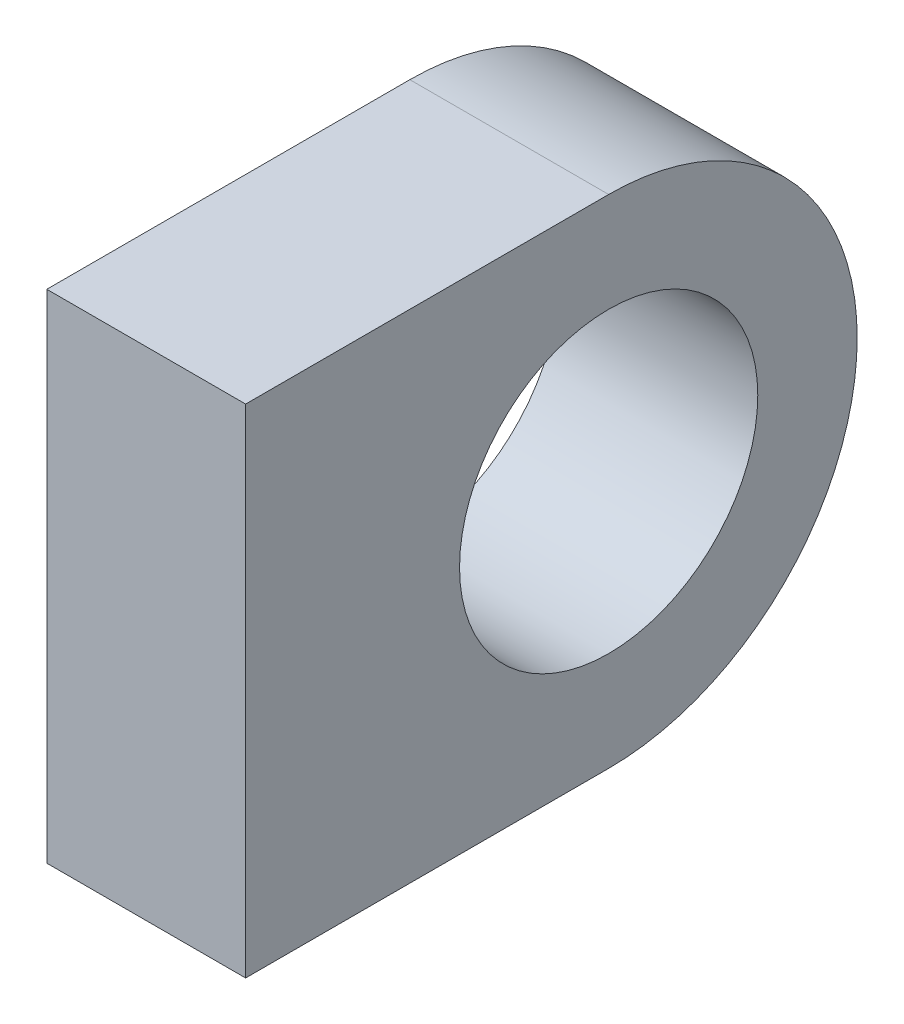
ISO-10303-21;
HEADER;
FILE_DESCRIPTION(('STEP AP214'),'2;1');
FILE_NAME('part.step','',(''),(''),'','','');
FILE_SCHEMA(('AUTOMOTIVE_DESIGN { 1 0 10303 214 1 1 1 1 }'));
ENDSEC;
DATA;
#1=APPLICATION_CONTEXT('core data for automotive mechanical design processes');
#2=APPLICATION_PROTOCOL_DEFINITION('international standard','automotive_design',2000,#1);
#3=PRODUCT_CONTEXT('',#1,'mechanical');
#4=PRODUCT('Part','Part','',(#3));
#5=PRODUCT_RELATED_PRODUCT_CATEGORY('part','',(#4));
#6=PRODUCT_DEFINITION_FORMATION('','',#4);
#7=PRODUCT_DEFINITION_CONTEXT('part definition',#1,'design');
#8=PRODUCT_DEFINITION('design','',#6,#7);
#9=PRODUCT_DEFINITION_SHAPE('','',#8);
#10=(LENGTH_UNIT() NAMED_UNIT(*) SI_UNIT(.MILLI.,.METRE.));
#11=(NAMED_UNIT(*) PLANE_ANGLE_UNIT() SI_UNIT($,.RADIAN.));
#12=(NAMED_UNIT(*) SI_UNIT($,.STERADIAN.) SOLID_ANGLE_UNIT());
#13=UNCERTAINTY_MEASURE_WITH_UNIT(LENGTH_MEASURE(1.E-05),#10,'distance_accuracy_value','');
#14=(GEOMETRIC_REPRESENTATION_CONTEXT(3) GLOBAL_UNCERTAINTY_ASSIGNED_CONTEXT((#13)) GLOBAL_UNIT_ASSIGNED_CONTEXT((#10,
#11,#12)) REPRESENTATION_CONTEXT('',''));
#15=CARTESIAN_POINT('',(0.,0.,0.));
#16=DIRECTION('',(0.,0.,1.));
#17=DIRECTION('',(1.,0.,0.));
#18=AXIS2_PLACEMENT_3D('',#15,#16,#17);
#19=CARTESIAN_POINT('',(10.,0.,0.));
#20=DIRECTION('',(1.,0.,0.));
#21=DIRECTION('',(0.,0.,-1.));
#22=AXIS2_PLACEMENT_3D('',#19,#20,#21);
#23=PLANE('',#22);
#24=CARTESIAN_POINT('',(10.,0.,0.));
#25=DIRECTION('',(1.,0.,0.));
#26=DIRECTION('',(0.,0.,-1.));
#27=AXIS2_PLACEMENT_3D('',#24,#25,#26);
#28=CIRCLE('',#27,12.5);
#29=CARTESIAN_POINT('',(10.,-12.5,0.));
#30=VERTEX_POINT('',#29);
#31=CARTESIAN_POINT('',(10.,12.5,0.));
#32=VERTEX_POINT('',#31);
#33=EDGE_CURVE('E84',#30,#32,#28,.T.);
#34=ORIENTED_EDGE('',*,*,#33,.T.);
#35=DIRECTION('',(0.,0.,1.));
#36=VECTOR('',#35,1.);
#37=CARTESIAN_POINT('',(10.,12.5,0.));
#38=LINE('',#37,#36);
#39=CARTESIAN_POINT('',(10.,12.5,18.2590535));
#40=VERTEX_POINT('',#39);
#41=EDGE_CURVE('E79',#32,#40,#38,.T.);
#42=ORIENTED_EDGE('',*,*,#41,.T.);
#43=DIRECTION('',(0.,-1.,0.));
#44=VECTOR('',#43,1.);
#45=CARTESIAN_POINT('',(10.,-12.5,18.2590535));
#46=LINE('',#45,#44);
#47=CARTESIAN_POINT('',(10.,-12.5,18.2590535));
#48=VERTEX_POINT('',#47);
#49=EDGE_CURVE('E82',#40,#48,#46,.T.);
#50=ORIENTED_EDGE('',*,*,#49,.T.);
#51=DIRECTION('',(0.,0.,-1.));
#52=VECTOR('',#51,1.);
#53=CARTESIAN_POINT('',(10.,-12.5,0.));
#54=LINE('',#53,#52);
#55=EDGE_CURVE('E49',#48,#30,#54,.T.);
#56=ORIENTED_EDGE('',*,*,#55,.T.);
#57=EDGE_LOOP('',(#34,#42,#50,#56));
#58=FACE_BOUND('',#57,.T.);
#59=CARTESIAN_POINT('',(10.,0.,0.));
#60=DIRECTION('',(1.,0.,0.));
#61=DIRECTION('',(0.,0.,-1.));
#62=AXIS2_PLACEMENT_3D('',#59,#60,#61);
#63=CIRCLE('',#62,7.5);
#64=CARTESIAN_POINT('',(10.,0.,-7.5));
#65=VERTEX_POINT('',#64);
#66=EDGE_CURVE('E99',#65,#65,#63,.T.);
#67=ORIENTED_EDGE('',*,*,#66,.F.);
#68=EDGE_LOOP('',(#67));
#69=FACE_BOUND('',#68,.T.);
#70=ADVANCED_FACE('F32',(#58,#69),#23,.T.);
#71=CARTESIAN_POINT('',(0.,0.,0.));
#72=DIRECTION('',(1.,0.,0.));
#73=DIRECTION('',(0.,0.,-1.));
#74=AXIS2_PLACEMENT_3D('',#71,#72,#73);
#75=PLANE('',#74);
#76=CARTESIAN_POINT('',(0.,0.,0.));
#77=DIRECTION('',(1.,0.,0.));
#78=DIRECTION('',(0.,0.,-1.));
#79=AXIS2_PLACEMENT_3D('',#76,#77,#78);
#80=CIRCLE('',#79,12.5);
#81=CARTESIAN_POINT('',(0.,-12.5,0.));
#82=VERTEX_POINT('',#81);
#83=CARTESIAN_POINT('',(0.,12.5,0.));
#84=VERTEX_POINT('',#83);
#85=EDGE_CURVE('E96',#82,#84,#80,.T.);
#86=ORIENTED_EDGE('',*,*,#85,.F.);
#87=DIRECTION('',(0.,0.,-1.));
#88=VECTOR('',#87,1.);
#89=CARTESIAN_POINT('',(0.,-12.5,0.));
#90=LINE('',#89,#88);
#91=CARTESIAN_POINT('',(0.,-12.5,18.2590535));
#92=VERTEX_POINT('',#91);
#93=EDGE_CURVE('E72',#92,#82,#90,.T.);
#94=ORIENTED_EDGE('',*,*,#93,.F.);
#95=DIRECTION('',(0.,-1.,0.));
#96=VECTOR('',#95,1.);
#97=CARTESIAN_POINT('',(0.,-12.5,18.2590535));
#98=LINE('',#97,#96);
#99=CARTESIAN_POINT('',(0.,12.5,18.2590535));
#100=VERTEX_POINT('',#99);
#101=EDGE_CURVE('E66',#100,#92,#98,.T.);
#102=ORIENTED_EDGE('',*,*,#101,.F.);
#103=DIRECTION('',(0.,0.,1.));
#104=VECTOR('',#103,1.);
#105=CARTESIAN_POINT('',(0.,12.5,0.));
#106=LINE('',#105,#104);
#107=EDGE_CURVE('E88',#84,#100,#106,.T.);
#108=ORIENTED_EDGE('',*,*,#107,.F.);
#109=EDGE_LOOP('',(#86,#94,#102,#108));
#110=FACE_BOUND('',#109,.T.);
#111=CARTESIAN_POINT('',(0.,0.,0.));
#112=DIRECTION('',(1.,0.,0.));
#113=DIRECTION('',(0.,0.,-1.));
#114=AXIS2_PLACEMENT_3D('',#111,#112,#113);
#115=CIRCLE('',#114,7.5);
#116=CARTESIAN_POINT('',(0.,0.,-7.5));
#117=VERTEX_POINT('',#116);
#118=EDGE_CURVE('E111',#117,#117,#115,.T.);
#119=ORIENTED_EDGE('',*,*,#118,.T.);
#120=EDGE_LOOP('',(#119));
#121=FACE_BOUND('',#120,.T.);
#122=ADVANCED_FACE('F107',(#110,#121),#75,.F.);
#123=CARTESIAN_POINT('',(10.,0.,0.));
#124=DIRECTION('',(-1.,0.,0.));
#125=DIRECTION('',(0.,0.,1.));
#126=AXIS2_PLACEMENT_3D('',#123,#124,#125);
#127=CYLINDRICAL_SURFACE('',#126,12.5);
#128=ORIENTED_EDGE('',*,*,#85,.T.);
#129=DIRECTION('',(-1.,0.,0.));
#130=VECTOR('',#129,1.);
#131=CARTESIAN_POINT('',(10.,12.5,0.));
#132=LINE('',#131,#130);
#133=EDGE_CURVE('E11',#32,#84,#132,.T.);
#134=ORIENTED_EDGE('',*,*,#133,.F.);
#135=ORIENTED_EDGE('',*,*,#33,.F.);
#136=DIRECTION('',(-1.,0.,0.));
#137=VECTOR('',#136,1.);
#138=CARTESIAN_POINT('',(10.,-12.5,0.));
#139=LINE('',#138,#137);
#140=EDGE_CURVE('E92',#30,#82,#139,.T.);
#141=ORIENTED_EDGE('',*,*,#140,.T.);
#142=EDGE_LOOP('',(#128,#134,#135,#141));
#143=FACE_BOUND('',#142,.T.);
#144=ADVANCED_FACE('F34',(#143),#127,.T.);
#145=CARTESIAN_POINT('',(10.,12.5,0.));
#146=DIRECTION('',(0.,-1.,0.));
#147=DIRECTION('',(0.,0.,-1.));
#148=AXIS2_PLACEMENT_3D('',#145,#146,#147);
#149=PLANE('',#148);
#150=ORIENTED_EDGE('',*,*,#107,.T.);
#151=DIRECTION('',(-1.,0.,0.));
#152=VECTOR('',#151,1.);
#153=CARTESIAN_POINT('',(10.,12.5,18.2590535));
#154=LINE('',#153,#152);
#155=EDGE_CURVE('E41',#40,#100,#154,.T.);
#156=ORIENTED_EDGE('',*,*,#155,.F.);
#157=ORIENTED_EDGE('',*,*,#41,.F.);
#158=ORIENTED_EDGE('',*,*,#133,.T.);
#159=EDGE_LOOP('',(#150,#156,#157,#158));
#160=FACE_BOUND('',#159,.T.);
#161=ADVANCED_FACE('F87',(#160),#149,.F.);
#162=CARTESIAN_POINT('',(10.,-12.5,18.2590535));
#163=DIRECTION('',(0.,0.,-1.));
#164=DIRECTION('',(-1.,0.,0.));
#165=AXIS2_PLACEMENT_3D('',#162,#163,#164);
#166=PLANE('',#165);
#167=ORIENTED_EDGE('',*,*,#101,.T.);
#168=DIRECTION('',(-1.,0.,0.));
#169=VECTOR('',#168,1.);
#170=CARTESIAN_POINT('',(10.,-12.5,18.2590535));
#171=LINE('',#170,#169);
#172=EDGE_CURVE('E89',#48,#92,#171,.T.);
#173=ORIENTED_EDGE('',*,*,#172,.F.);
#174=ORIENTED_EDGE('',*,*,#49,.F.);
#175=ORIENTED_EDGE('',*,*,#155,.T.);
#176=EDGE_LOOP('',(#167,#173,#174,#175));
#177=FACE_BOUND('',#176,.T.);
#178=ADVANCED_FACE('F90',(#177),#166,.F.);
#179=CARTESIAN_POINT('',(10.,-12.5,0.));
#180=DIRECTION('',(0.,1.,0.));
#181=DIRECTION('',(0.,0.,1.));
#182=AXIS2_PLACEMENT_3D('',#179,#180,#181);
#183=PLANE('',#182);
#184=ORIENTED_EDGE('',*,*,#93,.T.);
#185=ORIENTED_EDGE('',*,*,#140,.F.);
#186=ORIENTED_EDGE('',*,*,#55,.F.);
#187=ORIENTED_EDGE('',*,*,#172,.T.);
#188=EDGE_LOOP('',(#184,#185,#186,#187));
#189=FACE_BOUND('',#188,.T.);
#190=ADVANCED_FACE('F104',(#189),#183,.F.);
#191=CARTESIAN_POINT('',(10.,0.,0.));
#192=DIRECTION('',(-1.,0.,0.));
#193=DIRECTION('',(0.,0.,1.));
#194=AXIS2_PLACEMENT_3D('',#191,#192,#193);
#195=CYLINDRICAL_SURFACE('',#194,7.5);
#196=ORIENTED_EDGE('',*,*,#66,.T.);
#197=EDGE_LOOP('',(#196));
#198=FACE_BOUND('',#197,.T.);
#199=ORIENTED_EDGE('',*,*,#118,.F.);
#200=EDGE_LOOP('',(#199));
#201=FACE_BOUND('',#200,.T.);
#202=ADVANCED_FACE('F117',(#198,#201),#195,.F.);
#203=CLOSED_SHELL('',(#70,#122,#144,#161,#178,#190,#202));
#204=MANIFOLD_SOLID_BREP('B2',#203);
#205=ADVANCED_BREP_SHAPE_REPRESENTATION('',(#18,#204),#14);
#206=SHAPE_DEFINITION_REPRESENTATION(#9,#205);
ENDSEC;
END-ISO-10303-21;
